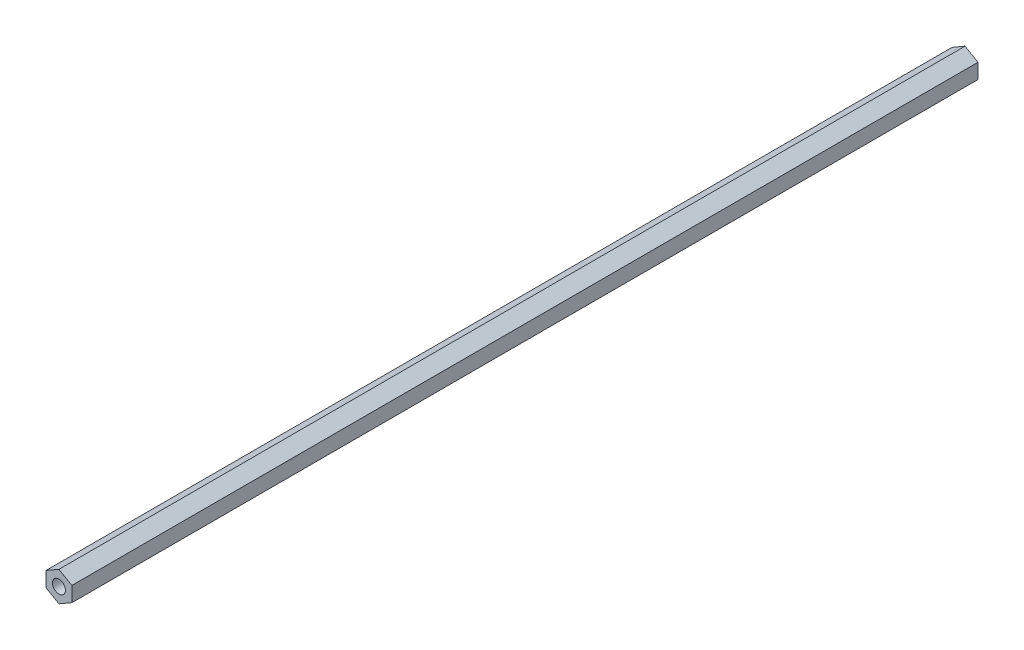
ISO-10303-21;
HEADER;
FILE_DESCRIPTION(('STEP AP214'),'2;1');
FILE_NAME('part.step','',(''),(''),'','','');
FILE_SCHEMA(('AUTOMOTIVE_DESIGN { 1 0 10303 214 1 1 1 1 }'));
ENDSEC;
DATA;
#1=APPLICATION_CONTEXT('core data for automotive mechanical design processes');
#2=APPLICATION_PROTOCOL_DEFINITION('international standard','automotive_design',2000,#1);
#3=PRODUCT_CONTEXT('',#1,'mechanical');
#4=PRODUCT('Part','Part','',(#3));
#5=PRODUCT_RELATED_PRODUCT_CATEGORY('part','',(#4));
#6=PRODUCT_DEFINITION_FORMATION('','',#4);
#7=PRODUCT_DEFINITION_CONTEXT('part definition',#1,'design');
#8=PRODUCT_DEFINITION('design','',#6,#7);
#9=PRODUCT_DEFINITION_SHAPE('','',#8);
#10=(LENGTH_UNIT() NAMED_UNIT(*) SI_UNIT(.MILLI.,.METRE.));
#11=(NAMED_UNIT(*) PLANE_ANGLE_UNIT() SI_UNIT($,.RADIAN.));
#12=(NAMED_UNIT(*) SI_UNIT($,.STERADIAN.) SOLID_ANGLE_UNIT());
#13=UNCERTAINTY_MEASURE_WITH_UNIT(LENGTH_MEASURE(1.E-05),#10,'distance_accuracy_value','');
#14=(GEOMETRIC_REPRESENTATION_CONTEXT(3) GLOBAL_UNCERTAINTY_ASSIGNED_CONTEXT((#13)) GLOBAL_UNIT_ASSIGNED_CONTEXT((#10,
#11,#12)) REPRESENTATION_CONTEXT('',''));
#15=CARTESIAN_POINT('',(0.,0.,0.));
#16=DIRECTION('',(0.,0.,1.));
#17=DIRECTION('',(1.,0.,0.));
#18=AXIS2_PLACEMENT_3D('',#15,#16,#17);
#19=CARTESIAN_POINT('',(-6.35,3.66617420935411,222.249999492));
#20=DIRECTION('',(1.,0.,0.));
#21=DIRECTION('',(0.,0.,-1.));
#22=AXIS2_PLACEMENT_3D('',#19,#20,#21);
#23=PLANE('',#22);
#24=DIRECTION('',(0.,0.,-1.));
#25=VECTOR('',#24,1.);
#26=CARTESIAN_POINT('',(-6.35,3.66617420935411,222.249999492));
#27=LINE('',#26,#25);
#28=CARTESIAN_POINT('',(-6.35,3.66617420935411,222.249999492));
#29=VERTEX_POINT('',#28);
#30=CARTESIAN_POINT('',(-6.35,3.66617420935411,-222.249999492));
#31=VERTEX_POINT('',#30);
#32=EDGE_CURVE('E142',#29,#31,#27,.T.);
#33=ORIENTED_EDGE('',*,*,#32,.T.);
#34=DIRECTION('',(0.,-1.,0.));
#35=VECTOR('',#34,1.);
#36=CARTESIAN_POINT('',(-6.35,3.66617420935411,-222.249999492));
#37=LINE('',#36,#35);
#38=CARTESIAN_POINT('',(-6.35,-3.66617420935413,-222.249999492));
#39=VERTEX_POINT('',#38);
#40=EDGE_CURVE('E114',#31,#39,#37,.T.);
#41=ORIENTED_EDGE('',*,*,#40,.T.);
#42=DIRECTION('',(0.,0.,-1.));
#43=VECTOR('',#42,1.);
#44=CARTESIAN_POINT('',(-6.35,-3.66617420935413,222.249999492));
#45=LINE('',#44,#43);
#46=CARTESIAN_POINT('',(-6.35,-3.66617420935413,222.249999492));
#47=VERTEX_POINT('',#46);
#48=EDGE_CURVE('E11',#47,#39,#45,.T.);
#49=ORIENTED_EDGE('',*,*,#48,.F.);
#50=DIRECTION('',(0.,-1.,0.));
#51=VECTOR('',#50,1.);
#52=CARTESIAN_POINT('',(-6.35,3.66617420935411,222.249999492));
#53=LINE('',#52,#51);
#54=EDGE_CURVE('E132',#29,#47,#53,.T.);
#55=ORIENTED_EDGE('',*,*,#54,.F.);
#56=EDGE_LOOP('',(#33,#41,#49,#55));
#57=FACE_BOUND('',#56,.T.);
#58=ADVANCED_FACE('F38',(#57),#23,.F.);
#59=CARTESIAN_POINT('',(-6.35,-3.66617420935413,222.249999492));
#60=DIRECTION('',(0.5,0.866025403784439,0.));
#61=DIRECTION('',(-0.866025403784439,0.5,0.));
#62=AXIS2_PLACEMENT_3D('',#59,#60,#61);
#63=PLANE('',#62);
#64=ORIENTED_EDGE('',*,*,#48,.T.);
#65=DIRECTION('',(0.866025403784439,-0.5,0.));
#66=VECTOR('',#65,1.);
#67=CARTESIAN_POINT('',(-6.35,-3.66617420935413,-222.249999492));
#68=LINE('',#67,#66);
#69=CARTESIAN_POINT('',(0.,-7.33234841870826,-222.249999492));
#70=VERTEX_POINT('',#69);
#71=EDGE_CURVE('E117',#39,#70,#68,.T.);
#72=ORIENTED_EDGE('',*,*,#71,.T.);
#73=DIRECTION('',(0.,0.,-1.));
#74=VECTOR('',#73,1.);
#75=CARTESIAN_POINT('',(0.,-7.33234841870826,222.249999492));
#76=LINE('',#75,#74);
#77=CARTESIAN_POINT('',(0.,-7.33234841870826,222.249999492));
#78=VERTEX_POINT('',#77);
#79=EDGE_CURVE('E45',#78,#70,#76,.T.);
#80=ORIENTED_EDGE('',*,*,#79,.F.);
#81=DIRECTION('',(0.866025403784439,-0.5,0.));
#82=VECTOR('',#81,1.);
#83=CARTESIAN_POINT('',(-6.35,-3.66617420935413,222.249999492));
#84=LINE('',#83,#82);
#85=EDGE_CURVE('E134',#47,#78,#84,.T.);
#86=ORIENTED_EDGE('',*,*,#85,.F.);
#87=EDGE_LOOP('',(#64,#72,#80,#86));
#88=FACE_BOUND('',#87,.T.);
#89=ADVANCED_FACE('F162',(#88),#63,.F.);
#90=CARTESIAN_POINT('',(0.,-7.33234841870826,222.249999492));
#91=DIRECTION('',(-0.5,0.866025403784439,0.));
#92=DIRECTION('',(-0.866025403784439,-0.5,0.));
#93=AXIS2_PLACEMENT_3D('',#90,#91,#92);
#94=PLANE('',#93);
#95=ORIENTED_EDGE('',*,*,#79,.T.);
#96=DIRECTION('',(0.866025403784439,0.5,0.));
#97=VECTOR('',#96,1.);
#98=CARTESIAN_POINT('',(0.,-7.33234841870826,-222.249999492));
#99=LINE('',#98,#97);
#100=CARTESIAN_POINT('',(6.35,-3.66617420935414,-222.249999492));
#101=VERTEX_POINT('',#100);
#102=EDGE_CURVE('E120',#70,#101,#99,.T.);
#103=ORIENTED_EDGE('',*,*,#102,.T.);
#104=DIRECTION('',(0.,0.,-1.));
#105=VECTOR('',#104,1.);
#106=CARTESIAN_POINT('',(6.35,-3.66617420935414,222.249999492));
#107=LINE('',#106,#105);
#108=CARTESIAN_POINT('',(6.35,-3.66617420935414,222.249999492));
#109=VERTEX_POINT('',#108);
#110=EDGE_CURVE('E148',#109,#101,#107,.T.);
#111=ORIENTED_EDGE('',*,*,#110,.F.);
#112=DIRECTION('',(0.866025403784439,0.5,0.));
#113=VECTOR('',#112,1.);
#114=CARTESIAN_POINT('',(0.,-7.33234841870826,222.249999492));
#115=LINE('',#114,#113);
#116=EDGE_CURVE('E136',#78,#109,#115,.T.);
#117=ORIENTED_EDGE('',*,*,#116,.F.);
#118=EDGE_LOOP('',(#95,#103,#111,#117));
#119=FACE_BOUND('',#118,.T.);
#120=ADVANCED_FACE('F153',(#119),#94,.F.);
#121=CARTESIAN_POINT('',(6.35,-3.66617420935414,222.249999492));
#122=DIRECTION('',(-1.,0.,0.));
#123=DIRECTION('',(0.,-1.,0.));
#124=AXIS2_PLACEMENT_3D('',#121,#122,#123);
#125=PLANE('',#124);
#126=ORIENTED_EDGE('',*,*,#110,.T.);
#127=DIRECTION('',(0.,1.,0.));
#128=VECTOR('',#127,1.);
#129=CARTESIAN_POINT('',(6.35,-3.66617420935414,-222.249999492));
#130=LINE('',#129,#128);
#131=CARTESIAN_POINT('',(6.35,3.66617420935412,-222.249999492));
#132=VERTEX_POINT('',#131);
#133=EDGE_CURVE('E123',#101,#132,#130,.T.);
#134=ORIENTED_EDGE('',*,*,#133,.T.);
#135=DIRECTION('',(0.,0.,-1.));
#136=VECTOR('',#135,1.);
#137=CARTESIAN_POINT('',(6.35,3.66617420935412,222.249999492));
#138=LINE('',#137,#136);
#139=CARTESIAN_POINT('',(6.35,3.66617420935412,222.249999492));
#140=VERTEX_POINT('',#139);
#141=EDGE_CURVE('E146',#140,#132,#138,.T.);
#142=ORIENTED_EDGE('',*,*,#141,.F.);
#143=DIRECTION('',(0.,1.,0.));
#144=VECTOR('',#143,1.);
#145=CARTESIAN_POINT('',(6.35,-3.66617420935414,222.249999492));
#146=LINE('',#145,#144);
#147=EDGE_CURVE('E138',#109,#140,#146,.T.);
#148=ORIENTED_EDGE('',*,*,#147,.F.);
#149=EDGE_LOOP('',(#126,#134,#142,#148));
#150=FACE_BOUND('',#149,.T.);
#151=ADVANCED_FACE('F173',(#150),#125,.F.);
#152=CARTESIAN_POINT('',(6.35,3.66617420935412,222.249999492));
#153=DIRECTION('',(-0.5,-0.866025403784439,0.));
#154=DIRECTION('',(0.866025403784439,-0.5,0.));
#155=AXIS2_PLACEMENT_3D('',#152,#153,#154);
#156=PLANE('',#155);
#157=ORIENTED_EDGE('',*,*,#141,.T.);
#158=DIRECTION('',(-0.866025403784439,0.5,0.));
#159=VECTOR('',#158,1.);
#160=CARTESIAN_POINT('',(6.35,3.66617420935412,-222.249999492));
#161=LINE('',#160,#159);
#162=CARTESIAN_POINT('',(0.,7.33234841870824,-222.249999492));
#163=VERTEX_POINT('',#162);
#164=EDGE_CURVE('E126',#132,#163,#161,.T.);
#165=ORIENTED_EDGE('',*,*,#164,.T.);
#166=DIRECTION('',(0.,0.,-1.));
#167=VECTOR('',#166,1.);
#168=CARTESIAN_POINT('',(0.,7.33234841870824,222.249999492));
#169=LINE('',#168,#167);
#170=CARTESIAN_POINT('',(0.,7.33234841870824,222.249999492));
#171=VERTEX_POINT('',#170);
#172=EDGE_CURVE('E144',#171,#163,#169,.T.);
#173=ORIENTED_EDGE('',*,*,#172,.F.);
#174=DIRECTION('',(-0.866025403784439,0.5,0.));
#175=VECTOR('',#174,1.);
#176=CARTESIAN_POINT('',(6.35,3.66617420935412,222.249999492));
#177=LINE('',#176,#175);
#178=EDGE_CURVE('E57',#140,#171,#177,.T.);
#179=ORIENTED_EDGE('',*,*,#178,.F.);
#180=EDGE_LOOP('',(#157,#165,#173,#179));
#181=FACE_BOUND('',#180,.T.);
#182=ADVANCED_FACE('F170',(#181),#156,.F.);
#183=CARTESIAN_POINT('',(0.,7.33234841870824,222.249999492));
#184=DIRECTION('',(0.5,-0.866025403784439,0.));
#185=DIRECTION('',(0.866025403784439,0.5,0.));
#186=AXIS2_PLACEMENT_3D('',#183,#184,#185);
#187=PLANE('',#186);
#188=ORIENTED_EDGE('',*,*,#172,.T.);
#189=DIRECTION('',(-0.866025403784439,-0.5,0.));
#190=VECTOR('',#189,1.);
#191=CARTESIAN_POINT('',(0.,7.33234841870824,-222.249999492));
#192=LINE('',#191,#190);
#193=EDGE_CURVE('E129',#163,#31,#192,.T.);
#194=ORIENTED_EDGE('',*,*,#193,.T.);
#195=ORIENTED_EDGE('',*,*,#32,.F.);
#196=DIRECTION('',(-0.866025403784439,-0.5,0.));
#197=VECTOR('',#196,1.);
#198=CARTESIAN_POINT('',(0.,7.33234841870824,222.249999492));
#199=LINE('',#198,#197);
#200=EDGE_CURVE('E52',#171,#29,#199,.T.);
#201=ORIENTED_EDGE('',*,*,#200,.F.);
#202=EDGE_LOOP('',(#188,#194,#195,#201));
#203=FACE_BOUND('',#202,.T.);
#204=ADVANCED_FACE('F168',(#203),#187,.F.);
#205=CARTESIAN_POINT('',(0.,0.,222.249999492));
#206=DIRECTION('',(0.,0.,1.));
#207=DIRECTION('',(1.,0.,0.));
#208=AXIS2_PLACEMENT_3D('',#205,#206,#207);
#209=PLANE('',#208);
#210=CARTESIAN_POINT('',(0.,0.,222.249999492));
#211=DIRECTION('',(0.,0.,1.));
#212=DIRECTION('',(1.,0.,0.));
#213=AXIS2_PLACEMENT_3D('',#210,#211,#212);
#214=CIRCLE('',#213,3.17499999999999);
#215=CARTESIAN_POINT('',(3.17499999999999,0.,222.249999492));
#216=VERTEX_POINT('',#215);
#217=EDGE_CURVE('E103',#216,#216,#214,.T.);
#218=ORIENTED_EDGE('',*,*,#217,.F.);
#219=EDGE_LOOP('',(#218));
#220=FACE_BOUND('',#219,.T.);
#221=ORIENTED_EDGE('',*,*,#54,.T.);
#222=ORIENTED_EDGE('',*,*,#85,.T.);
#223=ORIENTED_EDGE('',*,*,#116,.T.);
#224=ORIENTED_EDGE('',*,*,#147,.T.);
#225=ORIENTED_EDGE('',*,*,#178,.T.);
#226=ORIENTED_EDGE('',*,*,#200,.T.);
#227=EDGE_LOOP('',(#221,#222,#223,#224,#225,#226));
#228=FACE_BOUND('',#227,.T.);
#229=ADVANCED_FACE('F175',(#220,#228),#209,.T.);
#230=CARTESIAN_POINT('',(0.,0.,-222.249999492));
#231=DIRECTION('',(0.,0.,1.));
#232=DIRECTION('',(1.,0.,0.));
#233=AXIS2_PLACEMENT_3D('',#230,#231,#232);
#234=PLANE('',#233);
#235=CARTESIAN_POINT('',(0.,0.,-222.249999492));
#236=DIRECTION('',(0.,0.,-1.));
#237=DIRECTION('',(-1.,0.,0.));
#238=AXIS2_PLACEMENT_3D('',#235,#236,#237);
#239=CIRCLE('',#238,3.17499999999999);
#240=CARTESIAN_POINT('',(-3.17499999999999,0.,-222.249999492));
#241=VERTEX_POINT('',#240);
#242=EDGE_CURVE('E104',#241,#241,#239,.T.);
#243=ORIENTED_EDGE('',*,*,#242,.F.);
#244=EDGE_LOOP('',(#243));
#245=FACE_BOUND('',#244,.T.);
#246=ORIENTED_EDGE('',*,*,#40,.F.);
#247=ORIENTED_EDGE('',*,*,#193,.F.);
#248=ORIENTED_EDGE('',*,*,#164,.F.);
#249=ORIENTED_EDGE('',*,*,#133,.F.);
#250=ORIENTED_EDGE('',*,*,#102,.F.);
#251=ORIENTED_EDGE('',*,*,#71,.F.);
#252=EDGE_LOOP('',(#246,#247,#248,#249,#250,#251));
#253=FACE_BOUND('',#252,.T.);
#254=ADVANCED_FACE('F160',(#245,#253),#234,.F.);
#255=CARTESIAN_POINT('',(0.,0.,196.849999492));
#256=DIRECTION('',(0.,0.,1.));
#257=DIRECTION('',(1.,0.,0.));
#258=AXIS2_PLACEMENT_3D('',#255,#256,#257);
#259=CONICAL_SURFACE('',#258,3.17499999999995,1.02974425867665);
#260=CARTESIAN_POINT('',(0.,0.,194.942267026588));
#261=VERTEX_POINT('',#260);
#262=VERTEX_LOOP('',#261);
#263=FACE_BOUND('',#262,.T.);
#264=CARTESIAN_POINT('',(0.,0.,196.849999492));
#265=DIRECTION('',(0.,0.,1.));
#266=DIRECTION('',(1.,0.,0.));
#267=AXIS2_PLACEMENT_3D('',#264,#265,#266);
#268=CIRCLE('',#267,3.17499999999995);
#269=CARTESIAN_POINT('',(3.17499999999995,0.,196.849999492));
#270=VERTEX_POINT('',#269);
#271=EDGE_CURVE('E107',#270,#270,#268,.T.);
#272=ORIENTED_EDGE('',*,*,#271,.T.);
#273=EDGE_LOOP('',(#272));
#274=FACE_BOUND('',#273,.T.);
#275=ADVANCED_FACE('F183',(#263,#274),#259,.F.);
#276=CARTESIAN_POINT('',(0.,0.,222.249999492));
#277=DIRECTION('',(0.,0.,1.));
#278=DIRECTION('',(1.,0.,0.));
#279=AXIS2_PLACEMENT_3D('',#276,#277,#278);
#280=CYLINDRICAL_SURFACE('',#279,3.17499999999997);
#281=ORIENTED_EDGE('',*,*,#271,.F.);
#282=EDGE_LOOP('',(#281));
#283=FACE_BOUND('',#282,.T.);
#284=ORIENTED_EDGE('',*,*,#217,.T.);
#285=EDGE_LOOP('',(#284));
#286=FACE_BOUND('',#285,.T.);
#287=ADVANCED_FACE('F97',(#283,#286),#280,.F.);
#288=CARTESIAN_POINT('',(0.,0.,-196.849999492));
#289=DIRECTION('',(0.,0.,-1.));
#290=DIRECTION('',(-1.,0.,0.));
#291=AXIS2_PLACEMENT_3D('',#288,#289,#290);
#292=CONICAL_SURFACE('',#291,3.17499999999995,1.02974425867665);
#293=CARTESIAN_POINT('',(0.,0.,-194.942267026588));
#294=VERTEX_POINT('',#293);
#295=VERTEX_LOOP('',#294);
#296=FACE_BOUND('',#295,.T.);
#297=CARTESIAN_POINT('',(0.,0.,-196.849999492));
#298=DIRECTION('',(0.,0.,-1.));
#299=DIRECTION('',(-1.,0.,0.));
#300=AXIS2_PLACEMENT_3D('',#297,#298,#299);
#301=CIRCLE('',#300,3.17499999999995);
#302=CARTESIAN_POINT('',(-3.17499999999995,0.,-196.849999492));
#303=VERTEX_POINT('',#302);
#304=EDGE_CURVE('E101',#303,#303,#301,.T.);
#305=ORIENTED_EDGE('',*,*,#304,.T.);
#306=EDGE_LOOP('',(#305));
#307=FACE_BOUND('',#306,.T.);
#308=ADVANCED_FACE('F93',(#296,#307),#292,.F.);
#309=CARTESIAN_POINT('',(0.,0.,-222.249999492));
#310=DIRECTION('',(0.,0.,-1.));
#311=DIRECTION('',(-1.,0.,0.));
#312=AXIS2_PLACEMENT_3D('',#309,#310,#311);
#313=CYLINDRICAL_SURFACE('',#312,3.17499999999997);
#314=ORIENTED_EDGE('',*,*,#304,.F.);
#315=EDGE_LOOP('',(#314));
#316=FACE_BOUND('',#315,.T.);
#317=ORIENTED_EDGE('',*,*,#242,.T.);
#318=EDGE_LOOP('',(#317));
#319=FACE_BOUND('',#318,.T.);
#320=ADVANCED_FACE('F96',(#316,#319),#313,.F.);
#321=CLOSED_SHELL('',(#58,#89,#120,#151,#182,#204,#229,#254,#275,#287,#308,#320));
#322=MANIFOLD_SOLID_BREP('B2',#321);
#323=ADVANCED_BREP_SHAPE_REPRESENTATION('',(#18,#322),#14);
#324=SHAPE_DEFINITION_REPRESENTATION(#9,#323);
ENDSEC;
END-ISO-10303-21;
